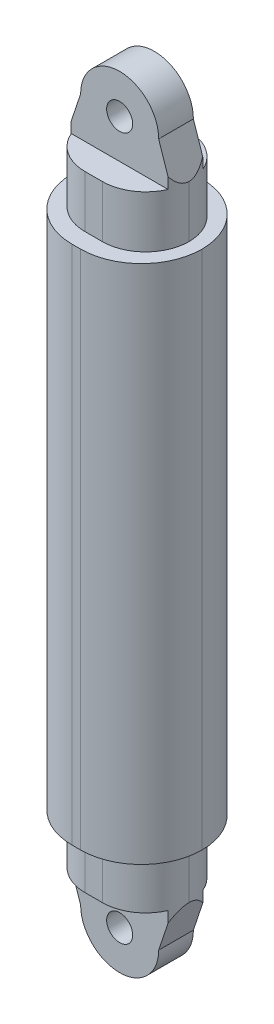
ISO-10303-21;
HEADER;
FILE_DESCRIPTION(('STEP AP214'),'2;1');
FILE_NAME('part.step','',(''),(''),'','','');
FILE_SCHEMA(('AUTOMOTIVE_DESIGN { 1 0 10303 214 1 1 1 1 }'));
ENDSEC;
DATA;
#1=APPLICATION_CONTEXT('core data for automotive mechanical design processes');
#2=APPLICATION_PROTOCOL_DEFINITION('international standard','automotive_design',2000,#1);
#3=PRODUCT_CONTEXT('',#1,'mechanical');
#4=PRODUCT('Part','Part','',(#3));
#5=PRODUCT_RELATED_PRODUCT_CATEGORY('part','',(#4));
#6=PRODUCT_DEFINITION_FORMATION('','',#4);
#7=PRODUCT_DEFINITION_CONTEXT('part definition',#1,'design');
#8=PRODUCT_DEFINITION('design','',#6,#7);
#9=PRODUCT_DEFINITION_SHAPE('','',#8);
#10=(LENGTH_UNIT() NAMED_UNIT(*) SI_UNIT(.MILLI.,.METRE.));
#11=(NAMED_UNIT(*) PLANE_ANGLE_UNIT() SI_UNIT($,.RADIAN.));
#12=(NAMED_UNIT(*) SI_UNIT($,.STERADIAN.) SOLID_ANGLE_UNIT());
#13=UNCERTAINTY_MEASURE_WITH_UNIT(LENGTH_MEASURE(1.E-05),#10,'distance_accuracy_value','');
#14=(GEOMETRIC_REPRESENTATION_CONTEXT(3) GLOBAL_UNCERTAINTY_ASSIGNED_CONTEXT((#13)) GLOBAL_UNIT_ASSIGNED_CONTEXT((#10,
#11,#12)) REPRESENTATION_CONTEXT('',''));
#15=CARTESIAN_POINT('',(0.,0.,0.));
#16=DIRECTION('',(0.,0.,1.));
#17=DIRECTION('',(1.,0.,0.));
#18=AXIS2_PLACEMENT_3D('',#15,#16,#17);
#19=CARTESIAN_POINT('',(-1.,0.,5.));
#20=DIRECTION('',(0.,-1.,0.));
#21=DIRECTION('',(0.,0.,-1.));
#22=AXIS2_PLACEMENT_3D('',#19,#20,#21);
#23=CYLINDRICAL_SURFACE('',#22,5.);
#24=CARTESIAN_POINT('',(-1.,-30.,5.));
#25=DIRECTION('',(0.,-1.,0.));
#26=DIRECTION('',(1.,0.,0.));
#27=AXIS2_PLACEMENT_3D('',#24,#25,#26);
#28=CIRCLE('',#27,5.);
#29=CARTESIAN_POINT('',(-6.,-30.,5.));
#30=VERTEX_POINT('',#29);
#31=CARTESIAN_POINT('',(-1.,-30.,10.));
#32=VERTEX_POINT('',#31);
#33=EDGE_CURVE('E438',#30,#32,#28,.F.);
#34=ORIENTED_EDGE('',*,*,#33,.F.);
#35=DIRECTION('',(0.,-1.,0.));
#36=VECTOR('',#35,1.);
#37=CARTESIAN_POINT('',(-6.,-45.,5.));
#38=LINE('',#37,#36);
#39=CARTESIAN_POINT('',(-6.,-36.,5.));
#40=VERTEX_POINT('',#39);
#41=EDGE_CURVE('E556',#40,#30,#38,.F.);
#42=ORIENTED_EDGE('',*,*,#41,.F.);
#43=CARTESIAN_POINT('',(-1.,-51.,5.));
#44=DIRECTION('',(0.948683298050513,0.316227766016839,0.));
#45=DIRECTION('',(0.316227766016839,-0.948683298050513,0.));
#46=AXIS2_PLACEMENT_3D('',#43,#44,#45);
#47=ELLIPSE('',#46,15.8113883008418,5.);
#48=CARTESIAN_POINT('',(-5.58257569495584,-37.2522729151325,7.));
#49=VERTEX_POINT('',#48);
#50=EDGE_CURVE('E477',#49,#40,#47,.F.);
#51=ORIENTED_EDGE('',*,*,#50,.F.);
#52=DIRECTION('',(0.,-1.,0.));
#53=VECTOR('',#52,1.);
#54=CARTESIAN_POINT('',(-5.58257569495584,0.,7.));
#55=LINE('',#54,#53);
#56=CARTESIAN_POINT('',(-5.58257569495584,-36.,7.));
#57=VERTEX_POINT('',#56);
#58=EDGE_CURVE('E525',#57,#49,#55,.T.);
#59=ORIENTED_EDGE('',*,*,#58,.F.);
#60=CARTESIAN_POINT('',(-1.,-36.,5.));
#61=DIRECTION('',(0.,-1.,0.));
#62=DIRECTION('',(0.,0.,-1.));
#63=AXIS2_PLACEMENT_3D('',#60,#61,#62);
#64=CIRCLE('',#63,5.);
#65=CARTESIAN_POINT('',(-1.,-36.,10.));
#66=VERTEX_POINT('',#65);
#67=EDGE_CURVE('E530',#57,#66,#64,.F.);
#68=ORIENTED_EDGE('',*,*,#67,.T.);
#69=DIRECTION('',(0.,-1.,0.));
#70=VECTOR('',#69,1.);
#71=CARTESIAN_POINT('',(-1.,0.,10.));
#72=LINE('',#71,#70);
#73=EDGE_CURVE('E547',#32,#66,#72,.T.);
#74=ORIENTED_EDGE('',*,*,#73,.F.);
#75=EDGE_LOOP('',(#34,#42,#51,#59,#68,#74));
#76=FACE_BOUND('',#75,.T.);
#77=ADVANCED_FACE('F135',(#76),#23,.T.);
#78=CARTESIAN_POINT('',(-1.,-45.,5.));
#79=DIRECTION('',(0.,1.,0.));
#80=DIRECTION('',(0.,0.,1.));
#81=AXIS2_PLACEMENT_3D('',#78,#79,#80);
#82=CYLINDRICAL_SURFACE('',#81,5.);
#83=CARTESIAN_POINT('',(-1.,-30.,5.));
#84=DIRECTION('',(0.,-1.,0.));
#85=DIRECTION('',(1.,0.,0.));
#86=AXIS2_PLACEMENT_3D('',#83,#84,#85);
#87=CIRCLE('',#86,5.);
#88=CARTESIAN_POINT('',(-1.,-30.,0.));
#89=VERTEX_POINT('',#88);
#90=EDGE_CURVE('E435',#89,#30,#87,.F.);
#91=ORIENTED_EDGE('',*,*,#90,.F.);
#92=DIRECTION('',(0.,-1.,0.));
#93=VECTOR('',#92,1.);
#94=CARTESIAN_POINT('',(-1.,45.,0.));
#95=LINE('',#94,#93);
#96=CARTESIAN_POINT('',(-1.,-36.,0.));
#97=VERTEX_POINT('',#96);
#98=EDGE_CURVE('E545',#97,#89,#95,.F.);
#99=ORIENTED_EDGE('',*,*,#98,.F.);
#100=CARTESIAN_POINT('',(-1.,-36.,5.));
#101=DIRECTION('',(0.,-1.,0.));
#102=DIRECTION('',(0.,0.,-1.));
#103=AXIS2_PLACEMENT_3D('',#100,#101,#102);
#104=CIRCLE('',#103,5.);
#105=CARTESIAN_POINT('',(-5.58257569495584,-36.,3.));
#106=VERTEX_POINT('',#105);
#107=EDGE_CURVE('E541',#97,#106,#104,.F.);
#108=ORIENTED_EDGE('',*,*,#107,.T.);
#109=DIRECTION('',(0.,1.,0.));
#110=VECTOR('',#109,1.);
#111=CARTESIAN_POINT('',(-5.58257569495584,-45.,3.));
#112=LINE('',#111,#110);
#113=CARTESIAN_POINT('',(-5.58257569495584,-37.2522729151325,3.));
#114=VERTEX_POINT('',#113);
#115=EDGE_CURVE('E537',#114,#106,#112,.T.);
#116=ORIENTED_EDGE('',*,*,#115,.F.);
#117=CARTESIAN_POINT('',(-1.,-51.,5.));
#118=DIRECTION('',(0.948683298050513,0.316227766016839,0.));
#119=DIRECTION('',(-0.316227766016839,0.948683298050513,0.));
#120=AXIS2_PLACEMENT_3D('',#117,#118,#119);
#121=ELLIPSE('',#120,15.8113883008418,5.);
#122=EDGE_CURVE('E479',#40,#114,#121,.F.);
#123=ORIENTED_EDGE('',*,*,#122,.F.);
#124=ORIENTED_EDGE('',*,*,#41,.T.);
#125=EDGE_LOOP('',(#91,#99,#108,#116,#123,#124));
#126=FACE_BOUND('',#125,.T.);
#127=ADVANCED_FACE('F644',(#126),#82,.T.);
#128=CARTESIAN_POINT('',(0.999999999999997,0.,5.));
#129=DIRECTION('',(0.,1.,0.));
#130=DIRECTION('',(0.,0.,1.));
#131=AXIS2_PLACEMENT_3D('',#128,#129,#130);
#132=CYLINDRICAL_SURFACE('',#131,5.);
#133=CARTESIAN_POINT('',(0.999999999999997,-30.,5.));
#134=DIRECTION('',(0.,-1.,0.));
#135=DIRECTION('',(1.,0.,0.));
#136=AXIS2_PLACEMENT_3D('',#133,#134,#135);
#137=CIRCLE('',#136,5.);
#138=CARTESIAN_POINT('',(0.999999999999997,-30.,10.));
#139=VERTEX_POINT('',#138);
#140=CARTESIAN_POINT('',(6.,-30.,5.));
#141=VERTEX_POINT('',#140);
#142=EDGE_CURVE('E432',#139,#141,#137,.F.);
#143=ORIENTED_EDGE('',*,*,#142,.F.);
#144=DIRECTION('',(0.,1.,0.));
#145=VECTOR('',#144,1.);
#146=CARTESIAN_POINT('',(0.999999999999997,0.,10.));
#147=LINE('',#146,#145);
#148=CARTESIAN_POINT('',(0.999999999999997,-36.,10.));
#149=VERTEX_POINT('',#148);
#150=EDGE_CURVE('E552',#149,#139,#147,.T.);
#151=ORIENTED_EDGE('',*,*,#150,.F.);
#152=CARTESIAN_POINT('',(0.999999999999997,-36.,5.));
#153=DIRECTION('',(0.,-1.,0.));
#154=DIRECTION('',(0.,0.,-1.));
#155=AXIS2_PLACEMENT_3D('',#152,#153,#154);
#156=CIRCLE('',#155,5.);
#157=CARTESIAN_POINT('',(5.58257569495584,-36.,7.));
#158=VERTEX_POINT('',#157);
#159=EDGE_CURVE('E568',#149,#158,#156,.F.);
#160=ORIENTED_EDGE('',*,*,#159,.T.);
#161=DIRECTION('',(0.,1.,0.));
#162=VECTOR('',#161,1.);
#163=CARTESIAN_POINT('',(5.58257569495584,0.,7.));
#164=LINE('',#163,#162);
#165=CARTESIAN_POINT('',(5.58257569495584,-37.2522729151325,7.));
#166=VERTEX_POINT('',#165);
#167=EDGE_CURVE('E566',#166,#158,#164,.T.);
#168=ORIENTED_EDGE('',*,*,#167,.F.);
#169=CARTESIAN_POINT('',(0.999999999999997,-51.,5.));
#170=DIRECTION('',(0.948683298050514,-0.316227766016839,0.));
#171=DIRECTION('',(0.316227766016839,0.948683298050514,0.));
#172=AXIS2_PLACEMENT_3D('',#169,#170,#171);
#173=ELLIPSE('',#172,15.8113883008419,5.);
#174=CARTESIAN_POINT('',(6.,-36.,5.));
#175=VERTEX_POINT('',#174);
#176=EDGE_CURVE('E487',#166,#175,#173,.F.);
#177=ORIENTED_EDGE('',*,*,#176,.T.);
#178=DIRECTION('',(0.,1.,0.));
#179=VECTOR('',#178,1.);
#180=CARTESIAN_POINT('',(6.,-45.,5.));
#181=LINE('',#180,#179);
#182=EDGE_CURVE('E543',#141,#175,#181,.F.);
#183=ORIENTED_EDGE('',*,*,#182,.F.);
#184=EDGE_LOOP('',(#143,#151,#160,#168,#177,#183));
#185=FACE_BOUND('',#184,.T.);
#186=ADVANCED_FACE('F651',(#185),#132,.T.);
#187=CARTESIAN_POINT('',(0.999999999999997,-45.,5.));
#188=DIRECTION('',(0.,-1.,0.));
#189=DIRECTION('',(0.,0.,-1.));
#190=AXIS2_PLACEMENT_3D('',#187,#188,#189);
#191=CYLINDRICAL_SURFACE('',#190,5.);
#192=CARTESIAN_POINT('',(0.999999999999997,-30.,5.));
#193=DIRECTION('',(0.,-1.,0.));
#194=DIRECTION('',(1.,0.,0.));
#195=AXIS2_PLACEMENT_3D('',#192,#193,#194);
#196=CIRCLE('',#195,5.);
#197=CARTESIAN_POINT('',(0.999999999999997,-30.,0.));
#198=VERTEX_POINT('',#197);
#199=EDGE_CURVE('E429',#141,#198,#196,.F.);
#200=ORIENTED_EDGE('',*,*,#199,.F.);
#201=ORIENTED_EDGE('',*,*,#182,.T.);
#202=CARTESIAN_POINT('',(0.999999999999997,-51.,5.));
#203=DIRECTION('',(0.948683298050514,-0.316227766016839,0.));
#204=DIRECTION('',(-0.316227766016839,-0.948683298050514,0.));
#205=AXIS2_PLACEMENT_3D('',#202,#203,#204);
#206=ELLIPSE('',#205,15.8113883008419,5.);
#207=CARTESIAN_POINT('',(5.58257569495584,-37.2522729151325,3.));
#208=VERTEX_POINT('',#207);
#209=EDGE_CURVE('E490',#175,#208,#206,.F.);
#210=ORIENTED_EDGE('',*,*,#209,.T.);
#211=DIRECTION('',(0.,-1.,0.));
#212=VECTOR('',#211,1.);
#213=CARTESIAN_POINT('',(5.58257569495584,-45.,3.));
#214=LINE('',#213,#212);
#215=CARTESIAN_POINT('',(5.58257569495584,-36.,3.));
#216=VERTEX_POINT('',#215);
#217=EDGE_CURVE('E555',#216,#208,#214,.T.);
#218=ORIENTED_EDGE('',*,*,#217,.F.);
#219=CARTESIAN_POINT('',(0.999999999999997,-36.,5.));
#220=DIRECTION('',(0.,-1.,0.));
#221=DIRECTION('',(0.,0.,-1.));
#222=AXIS2_PLACEMENT_3D('',#219,#220,#221);
#223=CIRCLE('',#222,5.);
#224=CARTESIAN_POINT('',(0.999999999999997,-36.,0.));
#225=VERTEX_POINT('',#224);
#226=EDGE_CURVE('E563',#216,#225,#223,.F.);
#227=ORIENTED_EDGE('',*,*,#226,.T.);
#228=DIRECTION('',(0.,1.,0.));
#229=VECTOR('',#228,1.);
#230=CARTESIAN_POINT('',(0.999999999999997,-45.,0.));
#231=LINE('',#230,#229);
#232=EDGE_CURVE('E344',#198,#225,#231,.F.);
#233=ORIENTED_EDGE('',*,*,#232,.F.);
#234=EDGE_LOOP('',(#200,#201,#210,#218,#227,#233));
#235=FACE_BOUND('',#234,.T.);
#236=ADVANCED_FACE('F714',(#235),#191,.T.);
#237=CARTESIAN_POINT('',(0.,0.,10.));
#238=DIRECTION('',(0.,0.,-1.));
#239=DIRECTION('',(-1.,0.,0.));
#240=AXIS2_PLACEMENT_3D('',#237,#238,#239);
#241=PLANE('',#240);
#242=ORIENTED_EDGE('',*,*,#150,.T.);
#243=DIRECTION('',(-1.,0.,0.));
#244=VECTOR('',#243,1.);
#245=CARTESIAN_POINT('',(0.,-30.,10.));
#246=LINE('',#245,#244);
#247=EDGE_CURVE('E441',#139,#32,#246,.T.);
#248=ORIENTED_EDGE('',*,*,#247,.T.);
#249=ORIENTED_EDGE('',*,*,#73,.T.);
#250=DIRECTION('',(-1.,0.,0.));
#251=VECTOR('',#250,1.);
#252=CARTESIAN_POINT('',(6.,-36.,10.));
#253=LINE('',#252,#251);
#254=EDGE_CURVE('E522',#149,#66,#253,.T.);
#255=ORIENTED_EDGE('',*,*,#254,.F.);
#256=EDGE_LOOP('',(#242,#248,#249,#255));
#257=FACE_BOUND('',#256,.T.);
#258=ADVANCED_FACE('F638',(#257),#241,.F.);
#259=CARTESIAN_POINT('',(0.,0.,0.));
#260=DIRECTION('',(0.,0.,-1.));
#261=DIRECTION('',(-1.,0.,0.));
#262=AXIS2_PLACEMENT_3D('',#259,#260,#261);
#263=PLANE('',#262);
#264=DIRECTION('',(-1.,0.,0.));
#265=VECTOR('',#264,1.);
#266=CARTESIAN_POINT('',(0.,-30.,0.));
#267=LINE('',#266,#265);
#268=EDGE_CURVE('E363',#198,#89,#267,.T.);
#269=ORIENTED_EDGE('',*,*,#268,.F.);
#270=ORIENTED_EDGE('',*,*,#232,.T.);
#271=DIRECTION('',(-1.,0.,0.));
#272=VECTOR('',#271,1.);
#273=CARTESIAN_POINT('',(0.,-36.,0.));
#274=LINE('',#273,#272);
#275=EDGE_CURVE('E533',#225,#97,#274,.T.);
#276=ORIENTED_EDGE('',*,*,#275,.T.);
#277=ORIENTED_EDGE('',*,*,#98,.T.);
#278=EDGE_LOOP('',(#269,#270,#276,#277));
#279=FACE_BOUND('',#278,.T.);
#280=ADVANCED_FACE('F671',(#279),#263,.T.);
#281=CARTESIAN_POINT('',(0.,-36.,3.));
#282=DIRECTION('',(0.,-1.,0.));
#283=DIRECTION('',(0.,0.,-1.));
#284=AXIS2_PLACEMENT_3D('',#281,#282,#283);
#285=PLANE('',#284);
#286=ORIENTED_EDGE('',*,*,#275,.F.);
#287=ORIENTED_EDGE('',*,*,#226,.F.);
#288=DIRECTION('',(-1.,0.,0.));
#289=VECTOR('',#288,1.);
#290=CARTESIAN_POINT('',(0.,-36.,3.));
#291=LINE('',#290,#289);
#292=EDGE_CURVE('E534',#216,#106,#291,.T.);
#293=ORIENTED_EDGE('',*,*,#292,.T.);
#294=ORIENTED_EDGE('',*,*,#107,.F.);
#295=EDGE_LOOP('',(#286,#287,#293,#294));
#296=FACE_BOUND('',#295,.T.);
#297=ADVANCED_FACE('F673',(#296),#285,.T.);
#298=CARTESIAN_POINT('',(0.,0.,3.));
#299=DIRECTION('',(0.,0.,1.));
#300=DIRECTION('',(1.,0.,0.));
#301=AXIS2_PLACEMENT_3D('',#298,#299,#300);
#302=PLANE('',#301);
#303=CARTESIAN_POINT('',(0.,-40.5,3.));
#304=DIRECTION('',(0.,0.,-1.));
#305=DIRECTION('',(-1.,0.,0.));
#306=AXIS2_PLACEMENT_3D('',#303,#304,#305);
#307=CIRCLE('',#306,1.5);
#308=CARTESIAN_POINT('',(-1.50000000000001,-40.5,3.));
#309=VERTEX_POINT('',#308);
#310=EDGE_CURVE('E470',#309,#309,#307,.T.);
#311=ORIENTED_EDGE('',*,*,#310,.F.);
#312=EDGE_LOOP('',(#311));
#313=FACE_BOUND('',#312,.T.);
#314=CARTESIAN_POINT('',(0.,-40.5,3.));
#315=DIRECTION('',(0.,0.,1.));
#316=DIRECTION('',(1.,0.,0.));
#317=AXIS2_PLACEMENT_3D('',#314,#315,#316);
#318=CIRCLE('',#317,4.5);
#319=CARTESIAN_POINT('',(4.49999999999999,-40.5,3.));
#320=VERTEX_POINT('',#319);
#321=CARTESIAN_POINT('',(-4.5,-40.5,3.));
#322=VERTEX_POINT('',#321);
#323=EDGE_CURVE('E495',#320,#322,#318,.F.);
#324=ORIENTED_EDGE('',*,*,#323,.T.);
#325=DIRECTION('',(-0.316227766016839,0.948683298050513,0.));
#326=VECTOR('',#325,1.);
#327=CARTESIAN_POINT('',(-16.2,-5.40000000000003,3.));
#328=LINE('',#327,#326);
#329=EDGE_CURVE('E481',#322,#114,#328,.T.);
#330=ORIENTED_EDGE('',*,*,#329,.T.);
#331=ORIENTED_EDGE('',*,*,#115,.T.);
#332=ORIENTED_EDGE('',*,*,#292,.F.);
#333=ORIENTED_EDGE('',*,*,#217,.T.);
#334=DIRECTION('',(0.316227766016839,0.948683298050514,0.));
#335=VECTOR('',#334,1.);
#336=CARTESIAN_POINT('',(16.2,-5.40000000000002,3.));
#337=LINE('',#336,#335);
#338=EDGE_CURVE('E493',#320,#208,#337,.T.);
#339=ORIENTED_EDGE('',*,*,#338,.F.);
#340=EDGE_LOOP('',(#324,#330,#331,#332,#333,#339));
#341=FACE_BOUND('',#340,.T.);
#342=ADVANCED_FACE('F676',(#313,#341),#302,.F.);
#343=CARTESIAN_POINT('',(6.,-36.,10.));
#344=DIRECTION('',(0.,-1.,0.));
#345=DIRECTION('',(0.,0.,-1.));
#346=AXIS2_PLACEMENT_3D('',#343,#344,#345);
#347=PLANE('',#346);
#348=DIRECTION('',(-1.,0.,0.));
#349=VECTOR('',#348,1.);
#350=CARTESIAN_POINT('',(6.,-36.,7.));
#351=LINE('',#350,#349);
#352=EDGE_CURVE('E521',#158,#57,#351,.T.);
#353=ORIENTED_EDGE('',*,*,#352,.F.);
#354=ORIENTED_EDGE('',*,*,#159,.F.);
#355=ORIENTED_EDGE('',*,*,#254,.T.);
#356=ORIENTED_EDGE('',*,*,#67,.F.);
#357=EDGE_LOOP('',(#353,#354,#355,#356));
#358=FACE_BOUND('',#357,.T.);
#359=ADVANCED_FACE('F680',(#358),#347,.T.);
#360=CARTESIAN_POINT('',(0.,0.,7.));
#361=DIRECTION('',(0.,0.,-1.));
#362=DIRECTION('',(-1.,0.,0.));
#363=AXIS2_PLACEMENT_3D('',#360,#361,#362);
#364=PLANE('',#363);
#365=CARTESIAN_POINT('',(0.,-40.5,7.));
#366=DIRECTION('',(0.,0.,-1.));
#367=DIRECTION('',(-1.,0.,0.));
#368=AXIS2_PLACEMENT_3D('',#365,#366,#367);
#369=CIRCLE('',#368,1.5);
#370=CARTESIAN_POINT('',(-1.50000000000001,-40.5,7.));
#371=VERTEX_POINT('',#370);
#372=EDGE_CURVE('E473',#371,#371,#369,.T.);
#373=ORIENTED_EDGE('',*,*,#372,.T.);
#374=EDGE_LOOP('',(#373));
#375=FACE_BOUND('',#374,.T.);
#376=DIRECTION('',(0.316227766016839,-0.948683298050513,0.));
#377=VECTOR('',#376,1.);
#378=CARTESIAN_POINT('',(-16.2,-5.40000000000003,7.));
#379=LINE('',#378,#377);
#380=CARTESIAN_POINT('',(-4.5,-40.5,7.));
#381=VERTEX_POINT('',#380);
#382=EDGE_CURVE('E580',#49,#381,#379,.T.);
#383=ORIENTED_EDGE('',*,*,#382,.T.);
#384=CARTESIAN_POINT('',(0.,-40.5,7.));
#385=DIRECTION('',(0.,0.,-1.));
#386=DIRECTION('',(-1.,0.,0.));
#387=AXIS2_PLACEMENT_3D('',#384,#385,#386);
#388=CIRCLE('',#387,4.5);
#389=CARTESIAN_POINT('',(4.49999999999999,-40.5,7.));
#390=VERTEX_POINT('',#389);
#391=EDGE_CURVE('E577',#381,#390,#388,.F.);
#392=ORIENTED_EDGE('',*,*,#391,.T.);
#393=DIRECTION('',(-0.316227766016839,-0.948683298050514,0.));
#394=VECTOR('',#393,1.);
#395=CARTESIAN_POINT('',(16.2,-5.40000000000002,7.));
#396=LINE('',#395,#394);
#397=EDGE_CURVE('E575',#166,#390,#396,.T.);
#398=ORIENTED_EDGE('',*,*,#397,.F.);
#399=ORIENTED_EDGE('',*,*,#167,.T.);
#400=ORIENTED_EDGE('',*,*,#352,.T.);
#401=ORIENTED_EDGE('',*,*,#58,.T.);
#402=EDGE_LOOP('',(#383,#392,#398,#399,#400,#401));
#403=FACE_BOUND('',#402,.T.);
#404=ADVANCED_FACE('F682',(#375,#403),#364,.F.);
#405=CARTESIAN_POINT('',(0.,-40.5,10.));
#406=DIRECTION('',(0.,0.,-1.));
#407=DIRECTION('',(-1.,0.,0.));
#408=AXIS2_PLACEMENT_3D('',#405,#406,#407);
#409=CYLINDRICAL_SURFACE('',#408,4.5);
#410=DIRECTION('',(0.,0.,-1.));
#411=VECTOR('',#410,1.);
#412=CARTESIAN_POINT('',(4.49999999999999,-40.5,10.));
#413=LINE('',#412,#411);
#414=EDGE_CURVE('E484',#390,#320,#413,.T.);
#415=ORIENTED_EDGE('',*,*,#414,.F.);
#416=ORIENTED_EDGE('',*,*,#391,.F.);
#417=DIRECTION('',(0.,0.,-1.));
#418=VECTOR('',#417,1.);
#419=CARTESIAN_POINT('',(-4.5,-40.5,10.));
#420=LINE('',#419,#418);
#421=EDGE_CURVE('E474',#381,#322,#420,.T.);
#422=ORIENTED_EDGE('',*,*,#421,.T.);
#423=ORIENTED_EDGE('',*,*,#323,.F.);
#424=EDGE_LOOP('',(#415,#416,#422,#423));
#425=FACE_BOUND('',#424,.T.);
#426=ADVANCED_FACE('F685',(#425),#409,.T.);
#427=CARTESIAN_POINT('',(16.2,-5.40000000000002,10.));
#428=DIRECTION('',(0.948683298050514,-0.316227766016839,0.));
#429=DIRECTION('',(0.316227766016839,0.948683298050514,0.));
#430=AXIS2_PLACEMENT_3D('',#427,#428,#429);
#431=PLANE('',#430);
#432=ORIENTED_EDGE('',*,*,#338,.T.);
#433=ORIENTED_EDGE('',*,*,#209,.F.);
#434=ORIENTED_EDGE('',*,*,#176,.F.);
#435=ORIENTED_EDGE('',*,*,#397,.T.);
#436=ORIENTED_EDGE('',*,*,#414,.T.);
#437=EDGE_LOOP('',(#432,#433,#434,#435,#436));
#438=FACE_BOUND('',#437,.T.);
#439=ADVANCED_FACE('F691',(#438),#431,.T.);
#440=CARTESIAN_POINT('',(-16.2,-5.40000000000003,10.));
#441=DIRECTION('',(0.948683298050513,0.316227766016839,0.));
#442=DIRECTION('',(-0.316227766016839,0.948683298050513,0.));
#443=AXIS2_PLACEMENT_3D('',#440,#441,#442);
#444=PLANE('',#443);
#445=ORIENTED_EDGE('',*,*,#421,.F.);
#446=ORIENTED_EDGE('',*,*,#382,.F.);
#447=ORIENTED_EDGE('',*,*,#50,.T.);
#448=ORIENTED_EDGE('',*,*,#122,.T.);
#449=ORIENTED_EDGE('',*,*,#329,.F.);
#450=EDGE_LOOP('',(#445,#446,#447,#448,#449));
#451=FACE_BOUND('',#450,.T.);
#452=ADVANCED_FACE('F701',(#451),#444,.F.);
#453=CARTESIAN_POINT('',(0.,-40.5,10.));
#454=DIRECTION('',(0.,0.,-1.));
#455=DIRECTION('',(-1.,0.,0.));
#456=AXIS2_PLACEMENT_3D('',#453,#454,#455);
#457=CYLINDRICAL_SURFACE('',#456,1.5);
#458=ORIENTED_EDGE('',*,*,#310,.T.);
#459=EDGE_LOOP('',(#458));
#460=FACE_BOUND('',#459,.T.);
#461=ORIENTED_EDGE('',*,*,#372,.F.);
#462=EDGE_LOOP('',(#461));
#463=FACE_BOUND('',#462,.T.);
#464=ADVANCED_FACE('F775',(#460,#463),#457,.F.);
#465=CARTESIAN_POINT('',(-7.50000000000001,-30.,-2.));
#466=DIRECTION('',(0.,-1.,0.));
#467=DIRECTION('',(1.,0.,0.));
#468=AXIS2_PLACEMENT_3D('',#465,#466,#467);
#469=PLANE('',#468);
#470=CARTESIAN_POINT('',(0.500000000000033,-30.,5.));
#471=DIRECTION('',(0.,-1.,0.));
#472=DIRECTION('',(1.,0.,0.));
#473=AXIS2_PLACEMENT_3D('',#470,#471,#472);
#474=CIRCLE('',#473,7.);
#475=CARTESIAN_POINT('',(0.500000000000034,-30.,-2.));
#476=VERTEX_POINT('',#475);
#477=CARTESIAN_POINT('',(7.50000000000003,-30.,5.));
#478=VERTEX_POINT('',#477);
#479=EDGE_CURVE('E383',#476,#478,#474,.T.);
#480=ORIENTED_EDGE('',*,*,#479,.T.);
#481=CARTESIAN_POINT('',(0.500000000000033,-30.,5.));
#482=DIRECTION('',(0.,-1.,0.));
#483=DIRECTION('',(1.,0.,0.));
#484=AXIS2_PLACEMENT_3D('',#481,#482,#483);
#485=CIRCLE('',#484,7.);
#486=CARTESIAN_POINT('',(0.500000000000034,-30.,12.));
#487=VERTEX_POINT('',#486);
#488=EDGE_CURVE('E385',#478,#487,#485,.T.);
#489=ORIENTED_EDGE('',*,*,#488,.T.);
#490=DIRECTION('',(1.,0.,0.));
#491=VECTOR('',#490,1.);
#492=CARTESIAN_POINT('',(-7.50000000000001,-30.,12.));
#493=LINE('',#492,#491);
#494=CARTESIAN_POINT('',(-0.500000000000014,-30.,12.));
#495=VERTEX_POINT('',#494);
#496=EDGE_CURVE('E401',#495,#487,#493,.T.);
#497=ORIENTED_EDGE('',*,*,#496,.F.);
#498=CARTESIAN_POINT('',(-0.500000000000014,-30.,5.));
#499=DIRECTION('',(0.,-1.,0.));
#500=DIRECTION('',(1.,0.,0.));
#501=AXIS2_PLACEMENT_3D('',#498,#499,#500);
#502=CIRCLE('',#501,7.);
#503=CARTESIAN_POINT('',(-7.50000000000001,-30.,5.));
#504=VERTEX_POINT('',#503);
#505=EDGE_CURVE('E381',#495,#504,#502,.T.);
#506=ORIENTED_EDGE('',*,*,#505,.T.);
#507=CARTESIAN_POINT('',(-0.500000000000014,-30.,5.));
#508=DIRECTION('',(0.,-1.,0.));
#509=DIRECTION('',(1.,0.,0.));
#510=AXIS2_PLACEMENT_3D('',#507,#508,#509);
#511=CIRCLE('',#510,7.);
#512=CARTESIAN_POINT('',(-0.500000000000014,-30.,-2.));
#513=VERTEX_POINT('',#512);
#514=EDGE_CURVE('E379',#504,#513,#511,.T.);
#515=ORIENTED_EDGE('',*,*,#514,.T.);
#516=DIRECTION('',(1.,0.,0.));
#517=VECTOR('',#516,1.);
#518=CARTESIAN_POINT('',(-7.50000000000001,-30.,-2.));
#519=LINE('',#518,#517);
#520=EDGE_CURVE('E356',#513,#476,#519,.T.);
#521=ORIENTED_EDGE('',*,*,#520,.T.);
#522=EDGE_LOOP('',(#480,#489,#497,#506,#515,#521));
#523=FACE_BOUND('',#522,.T.);
#524=ORIENTED_EDGE('',*,*,#247,.F.);
#525=ORIENTED_EDGE('',*,*,#142,.T.);
#526=ORIENTED_EDGE('',*,*,#199,.T.);
#527=ORIENTED_EDGE('',*,*,#268,.T.);
#528=ORIENTED_EDGE('',*,*,#90,.T.);
#529=ORIENTED_EDGE('',*,*,#33,.T.);
#530=EDGE_LOOP('',(#524,#525,#526,#527,#528,#529));
#531=FACE_BOUND('',#530,.T.);
#532=ADVANCED_FACE('F416',(#523,#531),#469,.T.);
#533=CARTESIAN_POINT('',(-7.5,30.,-2.));
#534=DIRECTION('',(0.,1.,0.));
#535=DIRECTION('',(0.,0.,1.));
#536=AXIS2_PLACEMENT_3D('',#533,#534,#535);
#537=PLANE('',#536);
#538=DIRECTION('',(-1.,0.,0.));
#539=VECTOR('',#538,1.);
#540=CARTESIAN_POINT('',(-7.5,30.,12.));
#541=LINE('',#540,#539);
#542=CARTESIAN_POINT('',(0.500000000000005,30.,12.));
#543=VERTEX_POINT('',#542);
#544=CARTESIAN_POINT('',(-0.499999999999995,30.,12.));
#545=VERTEX_POINT('',#544);
#546=EDGE_CURVE('E396',#543,#545,#541,.T.);
#547=ORIENTED_EDGE('',*,*,#546,.F.);
#548=CARTESIAN_POINT('',(0.500000000000004,30.,5.));
#549=DIRECTION('',(0.,1.,0.));
#550=DIRECTION('',(0.,0.,1.));
#551=AXIS2_PLACEMENT_3D('',#548,#549,#550);
#552=CIRCLE('',#551,7.);
#553=CARTESIAN_POINT('',(7.5,30.,5.));
#554=VERTEX_POINT('',#553);
#555=EDGE_CURVE('E392',#543,#554,#552,.T.);
#556=ORIENTED_EDGE('',*,*,#555,.T.);
#557=CARTESIAN_POINT('',(0.500000000000004,30.,5.));
#558=DIRECTION('',(0.,1.,0.));
#559=DIRECTION('',(0.,0.,1.));
#560=AXIS2_PLACEMENT_3D('',#557,#558,#559);
#561=CIRCLE('',#560,7.);
#562=CARTESIAN_POINT('',(0.500000000000005,30.,-2.));
#563=VERTEX_POINT('',#562);
#564=EDGE_CURVE('E158',#554,#563,#561,.T.);
#565=ORIENTED_EDGE('',*,*,#564,.T.);
#566=DIRECTION('',(-1.,0.,0.));
#567=VECTOR('',#566,1.);
#568=CARTESIAN_POINT('',(-7.5,30.,-2.));
#569=LINE('',#568,#567);
#570=CARTESIAN_POINT('',(-0.499999999999995,30.,-2.));
#571=VERTEX_POINT('',#570);
#572=EDGE_CURVE('E414',#563,#571,#569,.T.);
#573=ORIENTED_EDGE('',*,*,#572,.T.);
#574=CARTESIAN_POINT('',(-0.499999999999995,30.,5.));
#575=DIRECTION('',(0.,1.,0.));
#576=DIRECTION('',(0.,0.,1.));
#577=AXIS2_PLACEMENT_3D('',#574,#575,#576);
#578=CIRCLE('',#577,7.);
#579=CARTESIAN_POINT('',(-7.5,30.,5.));
#580=VERTEX_POINT('',#579);
#581=EDGE_CURVE('E387',#571,#580,#578,.T.);
#582=ORIENTED_EDGE('',*,*,#581,.T.);
#583=CARTESIAN_POINT('',(-0.499999999999995,30.,5.));
#584=DIRECTION('',(0.,1.,0.));
#585=DIRECTION('',(0.,0.,1.));
#586=AXIS2_PLACEMENT_3D('',#583,#584,#585);
#587=CIRCLE('',#586,7.);
#588=EDGE_CURVE('E389',#580,#545,#587,.T.);
#589=ORIENTED_EDGE('',*,*,#588,.T.);
#590=EDGE_LOOP('',(#547,#556,#565,#573,#582,#589));
#591=FACE_BOUND('',#590,.T.);
#592=DIRECTION('',(1.,0.,0.));
#593=VECTOR('',#592,1.);
#594=CARTESIAN_POINT('',(0.,30.,10.));
#595=LINE('',#594,#593);
#596=CARTESIAN_POINT('',(-1.,30.,10.));
#597=VERTEX_POINT('',#596);
#598=CARTESIAN_POINT('',(0.999999999999997,30.,10.));
#599=VERTEX_POINT('',#598);
#600=EDGE_CURVE('E427',#597,#599,#595,.T.);
#601=ORIENTED_EDGE('',*,*,#600,.F.);
#602=CARTESIAN_POINT('',(-1.,30.,5.));
#603=DIRECTION('',(0.,1.,0.));
#604=DIRECTION('',(0.,0.,1.));
#605=AXIS2_PLACEMENT_3D('',#602,#603,#604);
#606=CIRCLE('',#605,5.);
#607=CARTESIAN_POINT('',(-6.,30.,5.));
#608=VERTEX_POINT('',#607);
#609=EDGE_CURVE('E425',#597,#608,#606,.F.);
#610=ORIENTED_EDGE('',*,*,#609,.T.);
#611=CARTESIAN_POINT('',(-1.,30.,5.));
#612=DIRECTION('',(0.,1.,0.));
#613=DIRECTION('',(0.,0.,1.));
#614=AXIS2_PLACEMENT_3D('',#611,#612,#613);
#615=CIRCLE('',#614,5.);
#616=CARTESIAN_POINT('',(-1.,30.,0.));
#617=VERTEX_POINT('',#616);
#618=EDGE_CURVE('E362',#608,#617,#615,.F.);
#619=ORIENTED_EDGE('',*,*,#618,.T.);
#620=DIRECTION('',(1.,0.,0.));
#621=VECTOR('',#620,1.);
#622=CARTESIAN_POINT('',(0.,30.,0.));
#623=LINE('',#622,#621);
#624=CARTESIAN_POINT('',(0.999999999999997,30.,0.));
#625=VERTEX_POINT('',#624);
#626=EDGE_CURVE('E337',#617,#625,#623,.T.);
#627=ORIENTED_EDGE('',*,*,#626,.T.);
#628=CARTESIAN_POINT('',(0.999999999999997,30.,5.));
#629=DIRECTION('',(0.,1.,0.));
#630=DIRECTION('',(0.,0.,1.));
#631=AXIS2_PLACEMENT_3D('',#628,#629,#630);
#632=CIRCLE('',#631,5.);
#633=CARTESIAN_POINT('',(6.,30.,5.));
#634=VERTEX_POINT('',#633);
#635=EDGE_CURVE('E348',#625,#634,#632,.F.);
#636=ORIENTED_EDGE('',*,*,#635,.T.);
#637=CARTESIAN_POINT('',(0.999999999999997,30.,5.));
#638=DIRECTION('',(0.,1.,0.));
#639=DIRECTION('',(0.,0.,1.));
#640=AXIS2_PLACEMENT_3D('',#637,#638,#639);
#641=CIRCLE('',#640,5.);
#642=EDGE_CURVE('E355',#634,#599,#641,.F.);
#643=ORIENTED_EDGE('',*,*,#642,.T.);
#644=EDGE_LOOP('',(#601,#610,#619,#627,#636,#643));
#645=FACE_BOUND('',#644,.T.);
#646=ADVANCED_FACE('F360',(#591,#645),#537,.T.);
#647=CARTESIAN_POINT('',(0.,0.,-2.));
#648=DIRECTION('',(0.,0.,-1.));
#649=DIRECTION('',(-1.,0.,0.));
#650=AXIS2_PLACEMENT_3D('',#647,#648,#649);
#651=PLANE('',#650);
#652=ORIENTED_EDGE('',*,*,#572,.F.);
#653=DIRECTION('',(0.,1.,0.));
#654=VECTOR('',#653,1.);
#655=CARTESIAN_POINT('',(0.500000000000019,0.,-2.));
#656=LINE('',#655,#654);
#657=EDGE_CURVE('E12',#563,#476,#656,.F.);
#658=ORIENTED_EDGE('',*,*,#657,.T.);
#659=ORIENTED_EDGE('',*,*,#520,.F.);
#660=DIRECTION('',(0.,-1.,0.));
#661=VECTOR('',#660,1.);
#662=CARTESIAN_POINT('',(-0.500000000000005,0.,-2.));
#663=LINE('',#662,#661);
#664=EDGE_CURVE('E144',#513,#571,#663,.F.);
#665=ORIENTED_EDGE('',*,*,#664,.T.);
#666=EDGE_LOOP('',(#652,#658,#659,#665));
#667=FACE_BOUND('',#666,.T.);
#668=ADVANCED_FACE('F413',(#667),#651,.T.);
#669=CARTESIAN_POINT('',(0.,0.,12.));
#670=DIRECTION('',(0.,0.,-1.));
#671=DIRECTION('',(-1.,0.,0.));
#672=AXIS2_PLACEMENT_3D('',#669,#670,#671);
#673=PLANE('',#672);
#674=ORIENTED_EDGE('',*,*,#546,.T.);
#675=DIRECTION('',(0.,-1.,0.));
#676=VECTOR('',#675,1.);
#677=CARTESIAN_POINT('',(-0.500000000000014,-30.,12.));
#678=LINE('',#677,#676);
#679=EDGE_CURVE('E376',#545,#495,#678,.T.);
#680=ORIENTED_EDGE('',*,*,#679,.T.);
#681=ORIENTED_EDGE('',*,*,#496,.T.);
#682=DIRECTION('',(0.,1.,0.));
#683=VECTOR('',#682,1.);
#684=CARTESIAN_POINT('',(0.500000000000004,30.,12.));
#685=LINE('',#684,#683);
#686=EDGE_CURVE('E367',#487,#543,#685,.T.);
#687=ORIENTED_EDGE('',*,*,#686,.T.);
#688=EDGE_LOOP('',(#674,#680,#681,#687));
#689=FACE_BOUND('',#688,.T.);
#690=ADVANCED_FACE('F833',(#689),#673,.F.);
#691=CARTESIAN_POINT('',(0.,40.5,10.));
#692=DIRECTION('',(0.,0.,-1.));
#693=DIRECTION('',(-1.,0.,0.));
#694=AXIS2_PLACEMENT_3D('',#691,#692,#693);
#695=CYLINDRICAL_SURFACE('',#694,4.5);
#696=CARTESIAN_POINT('',(0.,40.5,3.));
#697=DIRECTION('',(0.,0.,1.));
#698=DIRECTION('',(1.,0.,0.));
#699=AXIS2_PLACEMENT_3D('',#696,#697,#698);
#700=CIRCLE('',#699,4.5);
#701=CARTESIAN_POINT('',(4.49999999999999,40.5,3.));
#702=VERTEX_POINT('',#701);
#703=CARTESIAN_POINT('',(-4.5,40.5,3.));
#704=VERTEX_POINT('',#703);
#705=EDGE_CURVE('E464',#702,#704,#700,.T.);
#706=ORIENTED_EDGE('',*,*,#705,.T.);
#707=DIRECTION('',(0.,0.,-1.));
#708=VECTOR('',#707,1.);
#709=CARTESIAN_POINT('',(-4.5,40.5,10.));
#710=LINE('',#709,#708);
#711=CARTESIAN_POINT('',(-4.5,40.5,7.));
#712=VERTEX_POINT('',#711);
#713=EDGE_CURVE('E443',#712,#704,#710,.T.);
#714=ORIENTED_EDGE('',*,*,#713,.F.);
#715=CARTESIAN_POINT('',(0.,40.5,7.));
#716=DIRECTION('',(0.,0.,-1.));
#717=DIRECTION('',(-1.,0.,0.));
#718=AXIS2_PLACEMENT_3D('',#715,#716,#717);
#719=CIRCLE('',#718,4.5);
#720=CARTESIAN_POINT('',(4.5,40.5,7.));
#721=VERTEX_POINT('',#720);
#722=EDGE_CURVE('E370',#712,#721,#719,.T.);
#723=ORIENTED_EDGE('',*,*,#722,.T.);
#724=DIRECTION('',(0.,0.,-1.));
#725=VECTOR('',#724,1.);
#726=CARTESIAN_POINT('',(4.49999999999999,40.5,10.));
#727=LINE('',#726,#725);
#728=EDGE_CURVE('E454',#721,#702,#727,.T.);
#729=ORIENTED_EDGE('',*,*,#728,.T.);
#730=EDGE_LOOP('',(#706,#714,#723,#729));
#731=FACE_BOUND('',#730,.T.);
#732=ADVANCED_FACE('F592',(#731),#695,.T.);
#733=CARTESIAN_POINT('',(0.,40.5,10.));
#734=DIRECTION('',(0.,0.,-1.));
#735=DIRECTION('',(-1.,0.,0.));
#736=AXIS2_PLACEMENT_3D('',#733,#734,#735);
#737=CYLINDRICAL_SURFACE('',#736,1.5);
#738=CARTESIAN_POINT('',(0.,40.5,3.));
#739=DIRECTION('',(0.,0.,1.));
#740=DIRECTION('',(-1.,0.,0.));
#741=AXIS2_PLACEMENT_3D('',#738,#739,#740);
#742=CIRCLE('',#741,1.5);
#743=CARTESIAN_POINT('',(-1.50000000000001,40.5,3.));
#744=VERTEX_POINT('',#743);
#745=EDGE_CURVE('E466',#744,#744,#742,.T.);
#746=ORIENTED_EDGE('',*,*,#745,.F.);
#747=EDGE_LOOP('',(#746));
#748=FACE_BOUND('',#747,.T.);
#749=CARTESIAN_POINT('',(0.,40.5,7.));
#750=DIRECTION('',(0.,0.,-1.));
#751=DIRECTION('',(-1.,0.,0.));
#752=AXIS2_PLACEMENT_3D('',#749,#750,#751);
#753=CIRCLE('',#752,1.5);
#754=CARTESIAN_POINT('',(-1.50000000000001,40.5,7.));
#755=VERTEX_POINT('',#754);
#756=EDGE_CURVE('E469',#755,#755,#753,.F.);
#757=ORIENTED_EDGE('',*,*,#756,.T.);
#758=EDGE_LOOP('',(#757));
#759=FACE_BOUND('',#758,.T.);
#760=ADVANCED_FACE('F789',(#748,#759),#737,.F.);
#761=CARTESIAN_POINT('',(-16.2,5.40000000000003,10.));
#762=DIRECTION('',(-0.948683298050513,0.316227766016839,0.));
#763=DIRECTION('',(-0.316227766016839,-0.948683298050513,0.));
#764=AXIS2_PLACEMENT_3D('',#761,#762,#763);
#765=PLANE('',#764);
#766=DIRECTION('',(-0.316227766016839,-0.948683298050513,0.));
#767=VECTOR('',#766,1.);
#768=CARTESIAN_POINT('',(-16.2,5.40000000000003,3.));
#769=LINE('',#768,#767);
#770=CARTESIAN_POINT('',(-5.58257569495584,37.2522729151325,3.));
#771=VERTEX_POINT('',#770);
#772=EDGE_CURVE('E452',#704,#771,#769,.T.);
#773=ORIENTED_EDGE('',*,*,#772,.T.);
#774=CARTESIAN_POINT('',(-1.,51.,5.));
#775=DIRECTION('',(-0.948683298050513,0.316227766016839,0.));
#776=DIRECTION('',(0.316227766016839,0.948683298050513,0.));
#777=AXIS2_PLACEMENT_3D('',#774,#775,#776);
#778=ELLIPSE('',#777,15.8113883008418,5.);
#779=CARTESIAN_POINT('',(-6.,36.,5.));
#780=VERTEX_POINT('',#779);
#781=EDGE_CURVE('E364',#780,#771,#778,.F.);
#782=ORIENTED_EDGE('',*,*,#781,.F.);
#783=CARTESIAN_POINT('',(-1.,51.,5.));
#784=DIRECTION('',(-0.948683298050513,0.316227766016839,0.));
#785=DIRECTION('',(-0.316227766016839,-0.948683298050513,0.));
#786=AXIS2_PLACEMENT_3D('',#783,#784,#785);
#787=ELLIPSE('',#786,15.8113883008418,5.);
#788=CARTESIAN_POINT('',(-5.58257569495584,37.2522729151325,7.));
#789=VERTEX_POINT('',#788);
#790=EDGE_CURVE('E446',#789,#780,#787,.F.);
#791=ORIENTED_EDGE('',*,*,#790,.F.);
#792=DIRECTION('',(0.316227766016839,0.948683298050513,0.));
#793=VECTOR('',#792,1.);
#794=CARTESIAN_POINT('',(-16.2,5.40000000000003,7.));
#795=LINE('',#794,#793);
#796=EDGE_CURVE('E449',#789,#712,#795,.T.);
#797=ORIENTED_EDGE('',*,*,#796,.T.);
#798=ORIENTED_EDGE('',*,*,#713,.T.);
#799=EDGE_LOOP('',(#773,#782,#791,#797,#798));
#800=FACE_BOUND('',#799,.T.);
#801=ADVANCED_FACE('F620',(#800),#765,.T.);
#802=CARTESIAN_POINT('',(0.,0.,7.));
#803=DIRECTION('',(0.,0.,-1.));
#804=DIRECTION('',(-1.,0.,0.));
#805=AXIS2_PLACEMENT_3D('',#802,#803,#804);
#806=PLANE('',#805);
#807=ORIENTED_EDGE('',*,*,#756,.F.);
#808=EDGE_LOOP('',(#807));
#809=FACE_BOUND('',#808,.T.);
#810=ORIENTED_EDGE('',*,*,#722,.F.);
#811=ORIENTED_EDGE('',*,*,#796,.F.);
#812=DIRECTION('',(0.,-1.,0.));
#813=VECTOR('',#812,1.);
#814=CARTESIAN_POINT('',(-5.58257569495584,0.,7.));
#815=LINE('',#814,#813);
#816=CARTESIAN_POINT('',(-5.58257569495584,36.,7.));
#817=VERTEX_POINT('',#816);
#818=EDGE_CURVE('E506',#789,#817,#815,.T.);
#819=ORIENTED_EDGE('',*,*,#818,.T.);
#820=DIRECTION('',(-1.,0.,0.));
#821=VECTOR('',#820,1.);
#822=CARTESIAN_POINT('',(6.,36.,7.));
#823=LINE('',#822,#821);
#824=CARTESIAN_POINT('',(5.58257569495584,36.,7.));
#825=VERTEX_POINT('',#824);
#826=EDGE_CURVE('E497',#825,#817,#823,.T.);
#827=ORIENTED_EDGE('',*,*,#826,.F.);
#828=DIRECTION('',(0.,1.,0.));
#829=VECTOR('',#828,1.);
#830=CARTESIAN_POINT('',(5.58257569495584,0.,7.));
#831=LINE('',#830,#829);
#832=CARTESIAN_POINT('',(5.58257569495584,37.2522729151325,7.));
#833=VERTEX_POINT('',#832);
#834=EDGE_CURVE('E501',#825,#833,#831,.T.);
#835=ORIENTED_EDGE('',*,*,#834,.T.);
#836=DIRECTION('',(-0.316227766016839,0.948683298050514,0.));
#837=VECTOR('',#836,1.);
#838=CARTESIAN_POINT('',(16.2,5.40000000000002,7.));
#839=LINE('',#838,#837);
#840=EDGE_CURVE('E583',#833,#721,#839,.T.);
#841=ORIENTED_EDGE('',*,*,#840,.T.);
#842=EDGE_LOOP('',(#810,#811,#819,#827,#835,#841));
#843=FACE_BOUND('',#842,.T.);
#844=ADVANCED_FACE('F596',(#809,#843),#806,.F.);
#845=CARTESIAN_POINT('',(16.2,5.40000000000002,10.));
#846=DIRECTION('',(-0.948683298050514,-0.316227766016839,0.));
#847=DIRECTION('',(0.316227766016839,-0.948683298050514,0.));
#848=AXIS2_PLACEMENT_3D('',#845,#846,#847);
#849=PLANE('',#848);
#850=ORIENTED_EDGE('',*,*,#728,.F.);
#851=ORIENTED_EDGE('',*,*,#840,.F.);
#852=CARTESIAN_POINT('',(0.999999999999997,51.,5.));
#853=DIRECTION('',(-0.948683298050514,-0.316227766016839,0.));
#854=DIRECTION('',(-0.316227766016839,0.948683298050514,0.));
#855=AXIS2_PLACEMENT_3D('',#852,#853,#854);
#856=ELLIPSE('',#855,15.8113883008419,5.);
#857=CARTESIAN_POINT('',(6.,36.,5.));
#858=VERTEX_POINT('',#857);
#859=EDGE_CURVE('E457',#833,#858,#856,.F.);
#860=ORIENTED_EDGE('',*,*,#859,.T.);
#861=CARTESIAN_POINT('',(0.999999999999997,51.,5.));
#862=DIRECTION('',(-0.948683298050514,-0.316227766016839,0.));
#863=DIRECTION('',(0.316227766016839,-0.948683298050514,0.));
#864=AXIS2_PLACEMENT_3D('',#861,#862,#863);
#865=ELLIPSE('',#864,15.8113883008419,5.);
#866=CARTESIAN_POINT('',(5.58257569495584,37.2522729151325,3.));
#867=VERTEX_POINT('',#866);
#868=EDGE_CURVE('E459',#858,#867,#865,.F.);
#869=ORIENTED_EDGE('',*,*,#868,.T.);
#870=DIRECTION('',(0.316227766016839,-0.948683298050514,0.));
#871=VECTOR('',#870,1.);
#872=CARTESIAN_POINT('',(16.2,5.40000000000002,3.));
#873=LINE('',#872,#871);
#874=EDGE_CURVE('E461',#702,#867,#873,.T.);
#875=ORIENTED_EDGE('',*,*,#874,.F.);
#876=EDGE_LOOP('',(#850,#851,#860,#869,#875));
#877=FACE_BOUND('',#876,.T.);
#878=ADVANCED_FACE('F601',(#877),#849,.F.);
#879=CARTESIAN_POINT('',(0.,0.,3.));
#880=DIRECTION('',(0.,0.,1.));
#881=DIRECTION('',(1.,0.,0.));
#882=AXIS2_PLACEMENT_3D('',#879,#880,#881);
#883=PLANE('',#882);
#884=ORIENTED_EDGE('',*,*,#745,.T.);
#885=EDGE_LOOP('',(#884));
#886=FACE_BOUND('',#885,.T.);
#887=ORIENTED_EDGE('',*,*,#772,.F.);
#888=ORIENTED_EDGE('',*,*,#705,.F.);
#889=ORIENTED_EDGE('',*,*,#874,.T.);
#890=DIRECTION('',(0.,-1.,0.));
#891=VECTOR('',#890,1.);
#892=CARTESIAN_POINT('',(5.58257569495584,-45.,3.));
#893=LINE('',#892,#891);
#894=CARTESIAN_POINT('',(5.58257569495584,36.,3.));
#895=VERTEX_POINT('',#894);
#896=EDGE_CURVE('E513',#867,#895,#893,.T.);
#897=ORIENTED_EDGE('',*,*,#896,.T.);
#898=DIRECTION('',(-1.,0.,0.));
#899=VECTOR('',#898,1.);
#900=CARTESIAN_POINT('',(0.,36.,3.));
#901=LINE('',#900,#899);
#902=CARTESIAN_POINT('',(-5.58257569495584,36.,3.));
#903=VERTEX_POINT('',#902);
#904=EDGE_CURVE('E510',#895,#903,#901,.T.);
#905=ORIENTED_EDGE('',*,*,#904,.T.);
#906=DIRECTION('',(0.,1.,0.));
#907=VECTOR('',#906,1.);
#908=CARTESIAN_POINT('',(-5.58257569495584,-45.,3.));
#909=LINE('',#908,#907);
#910=EDGE_CURVE('E516',#903,#771,#909,.T.);
#911=ORIENTED_EDGE('',*,*,#910,.T.);
#912=EDGE_LOOP('',(#887,#888,#889,#897,#905,#911));
#913=FACE_BOUND('',#912,.T.);
#914=ADVANCED_FACE('F623',(#886,#913),#883,.F.);
#915=CARTESIAN_POINT('',(6.,36.,10.));
#916=DIRECTION('',(0.,-1.,0.));
#917=DIRECTION('',(0.,0.,-1.));
#918=AXIS2_PLACEMENT_3D('',#915,#916,#917);
#919=PLANE('',#918);
#920=CARTESIAN_POINT('',(-1.,36.,5.));
#921=DIRECTION('',(0.,-1.,0.));
#922=DIRECTION('',(0.,0.,-1.));
#923=AXIS2_PLACEMENT_3D('',#920,#921,#922);
#924=CIRCLE('',#923,5.);
#925=CARTESIAN_POINT('',(-1.,36.,10.));
#926=VERTEX_POINT('',#925);
#927=EDGE_CURVE('E508',#817,#926,#924,.F.);
#928=ORIENTED_EDGE('',*,*,#927,.T.);
#929=DIRECTION('',(-1.,0.,0.));
#930=VECTOR('',#929,1.);
#931=CARTESIAN_POINT('',(6.,36.,10.));
#932=LINE('',#931,#930);
#933=CARTESIAN_POINT('',(0.999999999999997,36.,10.));
#934=VERTEX_POINT('',#933);
#935=EDGE_CURVE('E498',#934,#926,#932,.T.);
#936=ORIENTED_EDGE('',*,*,#935,.F.);
#937=CARTESIAN_POINT('',(0.999999999999997,36.,5.));
#938=DIRECTION('',(0.,-1.,0.));
#939=DIRECTION('',(0.,0.,-1.));
#940=AXIS2_PLACEMENT_3D('',#937,#938,#939);
#941=CIRCLE('',#940,5.);
#942=EDGE_CURVE('E573',#934,#825,#941,.F.);
#943=ORIENTED_EDGE('',*,*,#942,.T.);
#944=ORIENTED_EDGE('',*,*,#826,.T.);
#945=EDGE_LOOP('',(#928,#936,#943,#944));
#946=FACE_BOUND('',#945,.T.);
#947=ADVANCED_FACE('F630',(#946),#919,.F.);
#948=CARTESIAN_POINT('',(0.,36.,3.));
#949=DIRECTION('',(0.,-1.,0.));
#950=DIRECTION('',(0.,0.,-1.));
#951=AXIS2_PLACEMENT_3D('',#948,#949,#950);
#952=PLANE('',#951);
#953=CARTESIAN_POINT('',(-1.,36.,5.));
#954=DIRECTION('',(0.,-1.,0.));
#955=DIRECTION('',(0.,0.,-1.));
#956=AXIS2_PLACEMENT_3D('',#953,#954,#955);
#957=CIRCLE('',#956,5.);
#958=CARTESIAN_POINT('',(-1.,36.,0.));
#959=VERTEX_POINT('',#958);
#960=EDGE_CURVE('E519',#959,#903,#957,.F.);
#961=ORIENTED_EDGE('',*,*,#960,.T.);
#962=ORIENTED_EDGE('',*,*,#904,.F.);
#963=CARTESIAN_POINT('',(0.999999999999997,36.,5.));
#964=DIRECTION('',(0.,-1.,0.));
#965=DIRECTION('',(0.,0.,-1.));
#966=AXIS2_PLACEMENT_3D('',#963,#964,#965);
#967=CIRCLE('',#966,5.);
#968=CARTESIAN_POINT('',(0.999999999999997,36.,0.));
#969=VERTEX_POINT('',#968);
#970=EDGE_CURVE('E571',#895,#969,#967,.F.);
#971=ORIENTED_EDGE('',*,*,#970,.T.);
#972=DIRECTION('',(-1.,0.,0.));
#973=VECTOR('',#972,1.);
#974=CARTESIAN_POINT('',(0.,36.,0.));
#975=LINE('',#974,#973);
#976=EDGE_CURVE('E340',#969,#959,#975,.T.);
#977=ORIENTED_EDGE('',*,*,#976,.T.);
#978=EDGE_LOOP('',(#961,#962,#971,#977));
#979=FACE_BOUND('',#978,.T.);
#980=ADVANCED_FACE('F627',(#979),#952,.F.);
#981=EDGE_CURVE('E548',#926,#597,#72,.T.);
#982=ORIENTED_EDGE('',*,*,#981,.T.);
#983=ORIENTED_EDGE('',*,*,#600,.T.);
#984=EDGE_CURVE('E551',#599,#934,#147,.T.);
#985=ORIENTED_EDGE('',*,*,#984,.T.);
#986=ORIENTED_EDGE('',*,*,#935,.T.);
#987=EDGE_LOOP('',(#982,#983,#985,#986));
#988=FACE_BOUND('',#987,.T.);
#989=ADVANCED_FACE('F607',(#988),#241,.F.);
#990=ORIENTED_EDGE('',*,*,#626,.F.);
#991=EDGE_CURVE('E343',#617,#959,#95,.F.);
#992=ORIENTED_EDGE('',*,*,#991,.T.);
#993=ORIENTED_EDGE('',*,*,#976,.F.);
#994=EDGE_CURVE('E333',#969,#625,#231,.F.);
#995=ORIENTED_EDGE('',*,*,#994,.T.);
#996=EDGE_LOOP('',(#990,#992,#993,#995));
#997=FACE_BOUND('',#996,.T.);
#998=ADVANCED_FACE('F335',(#997),#263,.T.);
#999=ORIENTED_EDGE('',*,*,#635,.F.);
#1000=ORIENTED_EDGE('',*,*,#994,.F.);
#1001=ORIENTED_EDGE('',*,*,#970,.F.);
#1002=ORIENTED_EDGE('',*,*,#896,.F.);
#1003=ORIENTED_EDGE('',*,*,#868,.F.);
#1004=EDGE_CURVE('E352',#858,#634,#181,.F.);
#1005=ORIENTED_EDGE('',*,*,#1004,.T.);
#1006=EDGE_LOOP('',(#999,#1000,#1001,#1002,#1003,#1005));
#1007=FACE_BOUND('',#1006,.T.);
#1008=ADVANCED_FACE('F349',(#1007),#191,.T.);
#1009=ORIENTED_EDGE('',*,*,#642,.F.);
#1010=ORIENTED_EDGE('',*,*,#1004,.F.);
#1011=ORIENTED_EDGE('',*,*,#859,.F.);
#1012=ORIENTED_EDGE('',*,*,#834,.F.);
#1013=ORIENTED_EDGE('',*,*,#942,.F.);
#1014=ORIENTED_EDGE('',*,*,#984,.F.);
#1015=EDGE_LOOP('',(#1009,#1010,#1011,#1012,#1013,#1014));
#1016=FACE_BOUND('',#1015,.T.);
#1017=ADVANCED_FACE('F603',(#1016),#132,.T.);
#1018=ORIENTED_EDGE('',*,*,#618,.F.);
#1019=EDGE_CURVE('E559',#608,#780,#38,.F.);
#1020=ORIENTED_EDGE('',*,*,#1019,.T.);
#1021=ORIENTED_EDGE('',*,*,#781,.T.);
#1022=ORIENTED_EDGE('',*,*,#910,.F.);
#1023=ORIENTED_EDGE('',*,*,#960,.F.);
#1024=ORIENTED_EDGE('',*,*,#991,.F.);
#1025=EDGE_LOOP('',(#1018,#1020,#1021,#1022,#1023,#1024));
#1026=FACE_BOUND('',#1025,.T.);
#1027=ADVANCED_FACE('F617',(#1026),#82,.T.);
#1028=ORIENTED_EDGE('',*,*,#609,.F.);
#1029=ORIENTED_EDGE('',*,*,#981,.F.);
#1030=ORIENTED_EDGE('',*,*,#927,.F.);
#1031=ORIENTED_EDGE('',*,*,#818,.F.);
#1032=ORIENTED_EDGE('',*,*,#790,.T.);
#1033=ORIENTED_EDGE('',*,*,#1019,.F.);
#1034=EDGE_LOOP('',(#1028,#1029,#1030,#1031,#1032,#1033));
#1035=FACE_BOUND('',#1034,.T.);
#1036=ADVANCED_FACE('F612',(#1035),#23,.T.);
#1037=CARTESIAN_POINT('',(-0.500000000000014,-30.,5.));
#1038=DIRECTION('',(0.,-1.,0.));
#1039=DIRECTION('',(1.,0.,0.));
#1040=AXIS2_PLACEMENT_3D('',#1037,#1038,#1039);
#1041=CYLINDRICAL_SURFACE('',#1040,7.);
#1042=DIRECTION('',(0.,-1.,0.));
#1043=VECTOR('',#1042,1.);
#1044=CARTESIAN_POINT('',(-7.50000000000001,-30.,5.));
#1045=LINE('',#1044,#1043);
#1046=EDGE_CURVE('E394',#580,#504,#1045,.T.);
#1047=ORIENTED_EDGE('',*,*,#1046,.F.);
#1048=ORIENTED_EDGE('',*,*,#581,.F.);
#1049=ORIENTED_EDGE('',*,*,#664,.F.);
#1050=ORIENTED_EDGE('',*,*,#514,.F.);
#1051=EDGE_LOOP('',(#1047,#1048,#1049,#1050));
#1052=FACE_BOUND('',#1051,.T.);
#1053=ADVANCED_FACE('F656',(#1052),#1041,.T.);
#1054=CARTESIAN_POINT('',(-0.500000000000005,0.,5.));
#1055=DIRECTION('',(0.,1.,0.));
#1056=DIRECTION('',(-1.,0.,0.));
#1057=AXIS2_PLACEMENT_3D('',#1054,#1055,#1056);
#1058=CYLINDRICAL_SURFACE('',#1057,7.);
#1059=ORIENTED_EDGE('',*,*,#588,.F.);
#1060=ORIENTED_EDGE('',*,*,#1046,.T.);
#1061=ORIENTED_EDGE('',*,*,#505,.F.);
#1062=ORIENTED_EDGE('',*,*,#679,.F.);
#1063=EDGE_LOOP('',(#1059,#1060,#1061,#1062));
#1064=FACE_BOUND('',#1063,.T.);
#1065=ADVANCED_FACE('F662',(#1064),#1058,.T.);
#1066=CARTESIAN_POINT('',(0.500000000000033,-30.,5.));
#1067=DIRECTION('',(0.,1.,0.));
#1068=DIRECTION('',(-1.,0.,0.));
#1069=AXIS2_PLACEMENT_3D('',#1066,#1067,#1068);
#1070=CYLINDRICAL_SURFACE('',#1069,7.);
#1071=DIRECTION('',(0.,1.,0.));
#1072=VECTOR('',#1071,1.);
#1073=CARTESIAN_POINT('',(7.50000000000003,-30.,5.));
#1074=LINE('',#1073,#1072);
#1075=EDGE_CURVE('E139',#478,#554,#1074,.T.);
#1076=ORIENTED_EDGE('',*,*,#1075,.F.);
#1077=ORIENTED_EDGE('',*,*,#479,.F.);
#1078=ORIENTED_EDGE('',*,*,#657,.F.);
#1079=ORIENTED_EDGE('',*,*,#564,.F.);
#1080=EDGE_LOOP('',(#1076,#1077,#1078,#1079));
#1081=FACE_BOUND('',#1080,.T.);
#1082=ADVANCED_FACE('F137',(#1081),#1070,.T.);
#1083=CARTESIAN_POINT('',(0.500000000000019,0.,5.));
#1084=DIRECTION('',(0.,-1.,0.));
#1085=DIRECTION('',(1.,0.,0.));
#1086=AXIS2_PLACEMENT_3D('',#1083,#1084,#1085);
#1087=CYLINDRICAL_SURFACE('',#1086,7.);
#1088=ORIENTED_EDGE('',*,*,#488,.F.);
#1089=ORIENTED_EDGE('',*,*,#1075,.T.);
#1090=ORIENTED_EDGE('',*,*,#555,.F.);
#1091=ORIENTED_EDGE('',*,*,#686,.F.);
#1092=EDGE_LOOP('',(#1088,#1089,#1090,#1091));
#1093=FACE_BOUND('',#1092,.T.);
#1094=ADVANCED_FACE('F407',(#1093),#1087,.T.);
#1095=CLOSED_SHELL('',(#77,#127,#186,#236,#258,#280,#297,#342,#359,#404,#426,#439,#452,#464,
#532,#646,#668,#690,#732,#760,#801,#844,#878,#914,#947,#980,#989,#998,#1008,#1017,#1027,#1036,
#1053,#1065,#1082,#1094));
#1096=MANIFOLD_SOLID_BREP('B2',#1095);
#1097=ADVANCED_BREP_SHAPE_REPRESENTATION('',(#18,#1096),#14);
#1098=SHAPE_DEFINITION_REPRESENTATION(#9,#1097);
ENDSEC;
END-ISO-10303-21;
